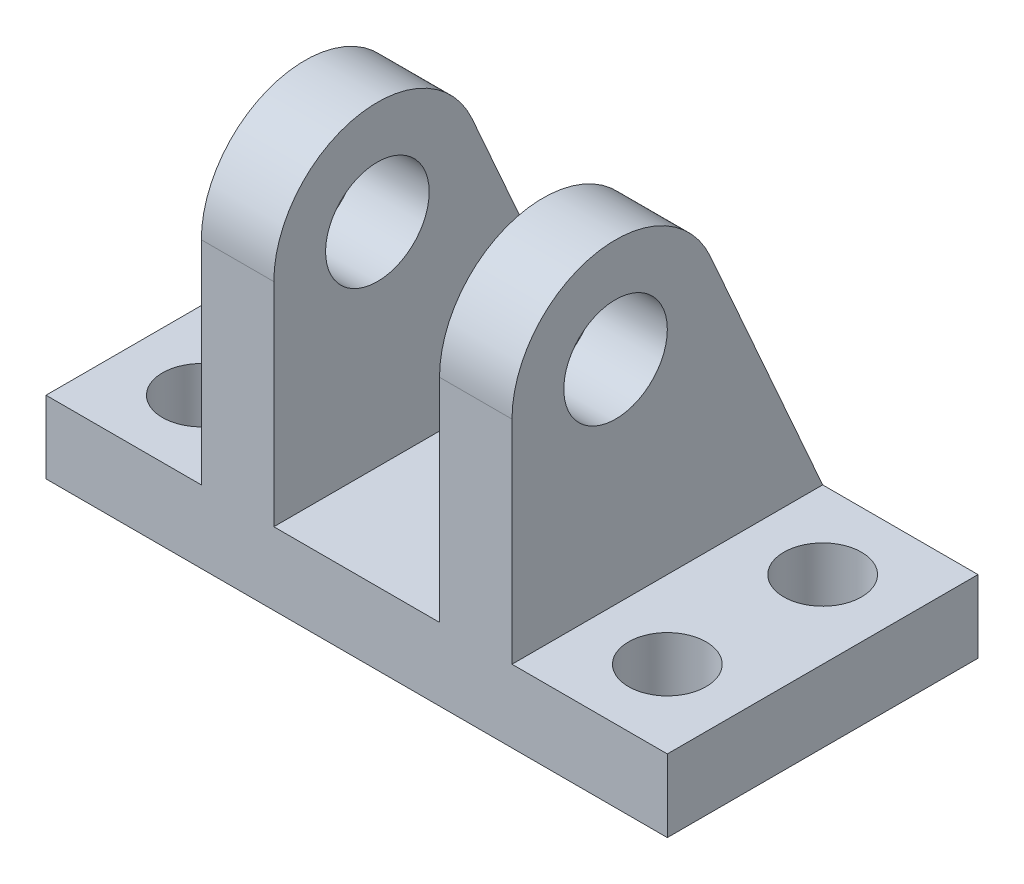
ISO-10303-21;
HEADER;
FILE_DESCRIPTION(('STEP AP214'),'2;1');
FILE_NAME('part.step','',(''),(''),'','','');
FILE_SCHEMA(('AUTOMOTIVE_DESIGN { 1 0 10303 214 1 1 1 1 }'));
ENDSEC;
DATA;
#1=APPLICATION_CONTEXT('core data for automotive mechanical design processes');
#2=APPLICATION_PROTOCOL_DEFINITION('international standard','automotive_design',2000,#1);
#3=PRODUCT_CONTEXT('',#1,'mechanical');
#4=PRODUCT('Part','Part','',(#3));
#5=PRODUCT_RELATED_PRODUCT_CATEGORY('part','',(#4));
#6=PRODUCT_DEFINITION_FORMATION('','',#4);
#7=PRODUCT_DEFINITION_CONTEXT('part definition',#1,'design');
#8=PRODUCT_DEFINITION('design','',#6,#7);
#9=PRODUCT_DEFINITION_SHAPE('','',#8);
#10=(LENGTH_UNIT() NAMED_UNIT(*) SI_UNIT(.MILLI.,.METRE.));
#11=(NAMED_UNIT(*) PLANE_ANGLE_UNIT() SI_UNIT($,.RADIAN.));
#12=(NAMED_UNIT(*) SI_UNIT($,.STERADIAN.) SOLID_ANGLE_UNIT());
#13=UNCERTAINTY_MEASURE_WITH_UNIT(LENGTH_MEASURE(1.E-05),#10,'distance_accuracy_value','');
#14=(GEOMETRIC_REPRESENTATION_CONTEXT(3) GLOBAL_UNCERTAINTY_ASSIGNED_CONTEXT((#13)) GLOBAL_UNIT_ASSIGNED_CONTEXT((#10,
#11,#12)) REPRESENTATION_CONTEXT('',''));
#15=CARTESIAN_POINT('',(0.,0.,0.));
#16=DIRECTION('',(0.,0.,1.));
#17=DIRECTION('',(1.,0.,0.));
#18=AXIS2_PLACEMENT_3D('',#15,#16,#17);
#19=CARTESIAN_POINT('',(6.,15.,6.));
#20=DIRECTION('',(-1.,0.,0.));
#21=DIRECTION('',(0.,0.,1.));
#22=AXIS2_PLACEMENT_3D('',#19,#20,#21);
#23=PLANE('',#22);
#24=CARTESIAN_POINT('',(6.,11.,2.));
#25=DIRECTION('',(1.,0.,0.));
#26=DIRECTION('',(0.,0.,-1.));
#27=AXIS2_PLACEMENT_3D('',#24,#25,#26);
#28=CIRCLE('',#27,2.);
#29=CARTESIAN_POINT('',(6.,11.,0.));
#30=VERTEX_POINT('',#29);
#31=EDGE_CURVE('E189',#30,#30,#28,.T.);
#32=ORIENTED_EDGE('',*,*,#31,.F.);
#33=EDGE_LOOP('',(#32));
#34=FACE_BOUND('',#33,.T.);
#35=DIRECTION('',(0.,-1.,0.));
#36=VECTOR('',#35,1.);
#37=CARTESIAN_POINT('',(6.,15.,6.));
#38=LINE('',#37,#36);
#39=CARTESIAN_POINT('',(6.,11.,6.));
#40=VERTEX_POINT('',#39);
#41=CARTESIAN_POINT('',(6.,2.8,6.));
#42=VERTEX_POINT('',#41);
#43=EDGE_CURVE('E247',#40,#42,#38,.T.);
#44=ORIENTED_EDGE('',*,*,#43,.T.);
#45=DIRECTION('',(0.,0.,-1.));
#46=VECTOR('',#45,1.);
#47=CARTESIAN_POINT('',(6.,2.8,-6.));
#48=LINE('',#47,#46);
#49=CARTESIAN_POINT('',(6.,2.8,-6.));
#50=VERTEX_POINT('',#49);
#51=EDGE_CURVE('E132',#42,#50,#48,.T.);
#52=ORIENTED_EDGE('',*,*,#51,.T.);
#53=DIRECTION('',(0.,0.914560454633472,0.404449224032656));
#54=VECTOR('',#53,1.);
#55=CARTESIAN_POINT('',(6.,2.67738128674249,-6.05422609645719));
#56=LINE('',#55,#54);
#57=CARTESIAN_POINT('',(6.,12.6177968961306,-1.65824181853389));
#58=VERTEX_POINT('',#57);
#59=EDGE_CURVE('E207',#50,#58,#56,.T.);
#60=ORIENTED_EDGE('',*,*,#59,.T.);
#61=CARTESIAN_POINT('',(6.,11.,2.));
#62=DIRECTION('',(-1.,0.,0.));
#63=DIRECTION('',(0.,0.,1.));
#64=AXIS2_PLACEMENT_3D('',#61,#62,#63);
#65=CIRCLE('',#64,4.);
#66=EDGE_CURVE('E205',#40,#58,#65,.T.);
#67=ORIENTED_EDGE('',*,*,#66,.F.);
#68=EDGE_LOOP('',(#44,#52,#60,#67));
#69=FACE_BOUND('',#68,.T.);
#70=ADVANCED_FACE('F38',(#34,#69),#23,.F.);
#71=CARTESIAN_POINT('',(-6.,15.,6.));
#72=DIRECTION('',(1.,0.,0.));
#73=DIRECTION('',(0.,0.,-1.));
#74=AXIS2_PLACEMENT_3D('',#71,#72,#73);
#75=PLANE('',#74);
#76=CARTESIAN_POINT('',(-6.,11.,2.));
#77=DIRECTION('',(1.,0.,0.));
#78=DIRECTION('',(0.,0.,-1.));
#79=AXIS2_PLACEMENT_3D('',#76,#77,#78);
#80=CIRCLE('',#79,2.);
#81=CARTESIAN_POINT('',(-6.,11.,0.));
#82=VERTEX_POINT('',#81);
#83=EDGE_CURVE('E192',#82,#82,#80,.T.);
#84=ORIENTED_EDGE('',*,*,#83,.T.);
#85=EDGE_LOOP('',(#84));
#86=FACE_BOUND('',#85,.T.);
#87=DIRECTION('',(0.,0.914560454633472,0.404449224032656));
#88=VECTOR('',#87,1.);
#89=CARTESIAN_POINT('',(-6.,2.67738128674249,-6.05422609645719));
#90=LINE('',#89,#88);
#91=CARTESIAN_POINT('',(-6.,2.8,-6.));
#92=VERTEX_POINT('',#91);
#93=CARTESIAN_POINT('',(-6.,12.6177968961306,-1.65824181853389));
#94=VERTEX_POINT('',#93);
#95=EDGE_CURVE('E208',#92,#94,#90,.T.);
#96=ORIENTED_EDGE('',*,*,#95,.F.);
#97=DIRECTION('',(0.,0.,1.));
#98=VECTOR('',#97,1.);
#99=CARTESIAN_POINT('',(-6.,2.8,-6.));
#100=LINE('',#99,#98);
#101=CARTESIAN_POINT('',(-6.,2.8,6.));
#102=VERTEX_POINT('',#101);
#103=EDGE_CURVE('E172',#92,#102,#100,.T.);
#104=ORIENTED_EDGE('',*,*,#103,.T.);
#105=DIRECTION('',(0.,-1.,0.));
#106=VECTOR('',#105,1.);
#107=CARTESIAN_POINT('',(-6.,15.,6.));
#108=LINE('',#107,#106);
#109=CARTESIAN_POINT('',(-6.,11.,6.));
#110=VERTEX_POINT('',#109);
#111=EDGE_CURVE('E46',#110,#102,#108,.T.);
#112=ORIENTED_EDGE('',*,*,#111,.F.);
#113=CARTESIAN_POINT('',(-6.,11.,2.));
#114=DIRECTION('',(-1.,0.,0.));
#115=DIRECTION('',(0.,0.,1.));
#116=AXIS2_PLACEMENT_3D('',#113,#114,#115);
#117=CIRCLE('',#116,4.);
#118=EDGE_CURVE('E204',#110,#94,#117,.T.);
#119=ORIENTED_EDGE('',*,*,#118,.T.);
#120=EDGE_LOOP('',(#96,#104,#112,#119));
#121=FACE_BOUND('',#120,.T.);
#122=ADVANCED_FACE('F256',(#86,#121),#75,.F.);
#123=CARTESIAN_POINT('',(-3.2,15.,-6.));
#124=DIRECTION('',(-1.,0.,0.));
#125=DIRECTION('',(0.,-1.,0.));
#126=AXIS2_PLACEMENT_3D('',#123,#124,#125);
#127=PLANE('',#126);
#128=CARTESIAN_POINT('',(-3.2,11.,2.));
#129=DIRECTION('',(-1.,0.,0.));
#130=DIRECTION('',(0.,-1.,0.));
#131=AXIS2_PLACEMENT_3D('',#128,#129,#130);
#132=CIRCLE('',#131,2.);
#133=CARTESIAN_POINT('',(-3.2,9.,2.));
#134=VERTEX_POINT('',#133);
#135=EDGE_CURVE('E197',#134,#134,#132,.T.);
#136=ORIENTED_EDGE('',*,*,#135,.T.);
#137=EDGE_LOOP('',(#136));
#138=FACE_BOUND('',#137,.T.);
#139=CARTESIAN_POINT('',(-3.2,11.,2.));
#140=DIRECTION('',(-1.,0.,0.));
#141=DIRECTION('',(0.,-1.,0.));
#142=AXIS2_PLACEMENT_3D('',#139,#140,#141);
#143=CIRCLE('',#142,4.);
#144=CARTESIAN_POINT('',(-3.2,11.,6.));
#145=VERTEX_POINT('',#144);
#146=CARTESIAN_POINT('',(-3.2,12.6177968961306,-1.65824181853389));
#147=VERTEX_POINT('',#146);
#148=EDGE_CURVE('E226',#145,#147,#143,.T.);
#149=ORIENTED_EDGE('',*,*,#148,.F.);
#150=DIRECTION('',(0.,-1.,0.));
#151=VECTOR('',#150,1.);
#152=CARTESIAN_POINT('',(-3.2,15.,6.));
#153=LINE('',#152,#151);
#154=CARTESIAN_POINT('',(-3.2,2.8,6.));
#155=VERTEX_POINT('',#154);
#156=EDGE_CURVE('E228',#145,#155,#153,.T.);
#157=ORIENTED_EDGE('',*,*,#156,.T.);
#158=DIRECTION('',(0.,0.,1.));
#159=VECTOR('',#158,1.);
#160=CARTESIAN_POINT('',(-3.2,2.8,-6.));
#161=LINE('',#160,#159);
#162=CARTESIAN_POINT('',(-3.2,2.8,-6.));
#163=VERTEX_POINT('',#162);
#164=EDGE_CURVE('E232',#163,#155,#161,.T.);
#165=ORIENTED_EDGE('',*,*,#164,.F.);
#166=DIRECTION('',(0.,0.914560454633472,0.404449224032656));
#167=VECTOR('',#166,1.);
#168=CARTESIAN_POINT('',(-3.2,13.0043340671885,-1.48730215226898));
#169=LINE('',#168,#167);
#170=EDGE_CURVE('E223',#163,#147,#169,.T.);
#171=ORIENTED_EDGE('',*,*,#170,.T.);
#172=EDGE_LOOP('',(#149,#157,#165,#171));
#173=FACE_BOUND('',#172,.T.);
#174=ADVANCED_FACE('F266',(#138,#173),#127,.F.);
#175=CARTESIAN_POINT('',(3.2,15.,-6.));
#176=DIRECTION('',(1.,0.,0.));
#177=DIRECTION('',(0.,1.,0.));
#178=AXIS2_PLACEMENT_3D('',#175,#176,#177);
#179=PLANE('',#178);
#180=CARTESIAN_POINT('',(3.2,11.,2.));
#181=DIRECTION('',(1.,0.,0.));
#182=DIRECTION('',(0.,1.,0.));
#183=AXIS2_PLACEMENT_3D('',#180,#181,#182);
#184=CIRCLE('',#183,2.);
#185=CARTESIAN_POINT('',(3.2,13.,2.));
#186=VERTEX_POINT('',#185);
#187=EDGE_CURVE('E41',#186,#186,#184,.T.);
#188=ORIENTED_EDGE('',*,*,#187,.T.);
#189=EDGE_LOOP('',(#188));
#190=FACE_BOUND('',#189,.T.);
#191=DIRECTION('',(0.,1.,0.));
#192=VECTOR('',#191,1.);
#193=CARTESIAN_POINT('',(3.2,15.,6.));
#194=LINE('',#193,#192);
#195=CARTESIAN_POINT('',(3.2,2.8,6.));
#196=VERTEX_POINT('',#195);
#197=CARTESIAN_POINT('',(3.2,11.,6.));
#198=VERTEX_POINT('',#197);
#199=EDGE_CURVE('E233',#196,#198,#194,.T.);
#200=ORIENTED_EDGE('',*,*,#199,.T.);
#201=CARTESIAN_POINT('',(3.2,11.,2.));
#202=DIRECTION('',(1.,0.,0.));
#203=DIRECTION('',(0.,1.,0.));
#204=AXIS2_PLACEMENT_3D('',#201,#202,#203);
#205=CIRCLE('',#204,4.);
#206=CARTESIAN_POINT('',(3.2,12.6177968961306,-1.65824181853389));
#207=VERTEX_POINT('',#206);
#208=EDGE_CURVE('E11',#207,#198,#205,.T.);
#209=ORIENTED_EDGE('',*,*,#208,.F.);
#210=DIRECTION('',(0.,-0.914560454633472,-0.404449224032656));
#211=VECTOR('',#210,1.);
#212=CARTESIAN_POINT('',(3.2,13.0043340671885,-1.48730215226898));
#213=LINE('',#212,#211);
#214=CARTESIAN_POINT('',(3.2,2.8,-6.));
#215=VERTEX_POINT('',#214);
#216=EDGE_CURVE('E218',#207,#215,#213,.T.);
#217=ORIENTED_EDGE('',*,*,#216,.T.);
#218=DIRECTION('',(0.,0.,1.));
#219=VECTOR('',#218,1.);
#220=CARTESIAN_POINT('',(3.2,2.8,-6.));
#221=LINE('',#220,#219);
#222=EDGE_CURVE('E240',#215,#196,#221,.T.);
#223=ORIENTED_EDGE('',*,*,#222,.T.);
#224=EDGE_LOOP('',(#200,#209,#217,#223));
#225=FACE_BOUND('',#224,.T.);
#226=ADVANCED_FACE('F279',(#190,#225),#179,.F.);
#227=CARTESIAN_POINT('',(-6.,15.,-6.));
#228=DIRECTION('',(0.,0.,1.));
#229=DIRECTION('',(1.,0.,0.));
#230=AXIS2_PLACEMENT_3D('',#227,#228,#229);
#231=PLANE('',#230);
#232=DIRECTION('',(-1.,0.,0.));
#233=VECTOR('',#232,1.);
#234=CARTESIAN_POINT('',(-6.,0.,-6.));
#235=LINE('',#234,#233);
#236=CARTESIAN_POINT('',(12.,0.,-6.));
#237=VERTEX_POINT('',#236);
#238=CARTESIAN_POINT('',(-12.,0.,-6.));
#239=VERTEX_POINT('',#238);
#240=EDGE_CURVE('E242',#237,#239,#235,.T.);
#241=ORIENTED_EDGE('',*,*,#240,.T.);
#242=DIRECTION('',(0.,-1.,0.));
#243=VECTOR('',#242,1.);
#244=CARTESIAN_POINT('',(-12.,16.2164078649987,-6.));
#245=LINE('',#244,#243);
#246=CARTESIAN_POINT('',(-12.,2.8,-6.));
#247=VERTEX_POINT('',#246);
#248=EDGE_CURVE('E166',#247,#239,#245,.T.);
#249=ORIENTED_EDGE('',*,*,#248,.F.);
#250=DIRECTION('',(1.,0.,0.));
#251=VECTOR('',#250,1.);
#252=CARTESIAN_POINT('',(-6.,2.8,-6.));
#253=LINE('',#252,#251);
#254=EDGE_CURVE('E180',#247,#92,#253,.T.);
#255=ORIENTED_EDGE('',*,*,#254,.T.);
#256=DIRECTION('',(-1.,0.,0.));
#257=VECTOR('',#256,1.);
#258=CARTESIAN_POINT('',(6.,2.8,-6.));
#259=LINE('',#258,#257);
#260=EDGE_CURVE('E211',#163,#92,#259,.T.);
#261=ORIENTED_EDGE('',*,*,#260,.F.);
#262=DIRECTION('',(1.,0.,0.));
#263=VECTOR('',#262,1.);
#264=CARTESIAN_POINT('',(-3.2,2.8,-6.));
#265=LINE('',#264,#263);
#266=EDGE_CURVE('E229',#163,#215,#265,.T.);
#267=ORIENTED_EDGE('',*,*,#266,.T.);
#268=EDGE_CURVE('E219',#50,#215,#259,.T.);
#269=ORIENTED_EDGE('',*,*,#268,.F.);
#270=DIRECTION('',(1.,0.,0.));
#271=VECTOR('',#270,1.);
#272=CARTESIAN_POINT('',(6.,2.8,-6.));
#273=LINE('',#272,#271);
#274=CARTESIAN_POINT('',(12.,2.8,-6.));
#275=VERTEX_POINT('',#274);
#276=EDGE_CURVE('E154',#50,#275,#273,.T.);
#277=ORIENTED_EDGE('',*,*,#276,.T.);
#278=DIRECTION('',(0.,-1.,0.));
#279=VECTOR('',#278,1.);
#280=CARTESIAN_POINT('',(12.,16.2164078649987,-6.));
#281=LINE('',#280,#279);
#282=EDGE_CURVE('E149',#275,#237,#281,.T.);
#283=ORIENTED_EDGE('',*,*,#282,.T.);
#284=EDGE_LOOP('',(#241,#249,#255,#261,#267,#269,#277,#283));
#285=FACE_BOUND('',#284,.T.);
#286=ADVANCED_FACE('F262',(#285),#231,.F.);
#287=CARTESIAN_POINT('',(-6.,15.,6.));
#288=DIRECTION('',(0.,0.,-1.));
#289=DIRECTION('',(-1.,0.,0.));
#290=AXIS2_PLACEMENT_3D('',#287,#288,#289);
#291=PLANE('',#290);
#292=ORIENTED_EDGE('',*,*,#43,.F.);
#293=DIRECTION('',(-1.,0.,0.));
#294=VECTOR('',#293,1.);
#295=CARTESIAN_POINT('',(6.,11.,6.));
#296=LINE('',#295,#294);
#297=EDGE_CURVE('E201',#40,#198,#296,.T.);
#298=ORIENTED_EDGE('',*,*,#297,.T.);
#299=ORIENTED_EDGE('',*,*,#199,.F.);
#300=DIRECTION('',(1.,0.,0.));
#301=VECTOR('',#300,1.);
#302=CARTESIAN_POINT('',(-3.2,2.8,6.));
#303=LINE('',#302,#301);
#304=EDGE_CURVE('E235',#155,#196,#303,.T.);
#305=ORIENTED_EDGE('',*,*,#304,.F.);
#306=ORIENTED_EDGE('',*,*,#156,.F.);
#307=EDGE_CURVE('E200',#145,#110,#296,.T.);
#308=ORIENTED_EDGE('',*,*,#307,.T.);
#309=ORIENTED_EDGE('',*,*,#111,.T.);
#310=DIRECTION('',(-1.,0.,0.));
#311=VECTOR('',#310,1.);
#312=CARTESIAN_POINT('',(-6.,2.8,6.));
#313=LINE('',#312,#311);
#314=CARTESIAN_POINT('',(-12.,2.8,6.));
#315=VERTEX_POINT('',#314);
#316=EDGE_CURVE('E53',#102,#315,#313,.T.);
#317=ORIENTED_EDGE('',*,*,#316,.T.);
#318=DIRECTION('',(0.,-1.,0.));
#319=VECTOR('',#318,1.);
#320=CARTESIAN_POINT('',(-12.,16.2164078649987,6.));
#321=LINE('',#320,#319);
#322=CARTESIAN_POINT('',(-12.,0.,6.));
#323=VERTEX_POINT('',#322);
#324=EDGE_CURVE('E176',#315,#323,#321,.T.);
#325=ORIENTED_EDGE('',*,*,#324,.T.);
#326=DIRECTION('',(1.,0.,0.));
#327=VECTOR('',#326,1.);
#328=CARTESIAN_POINT('',(-6.,0.,6.));
#329=LINE('',#328,#327);
#330=CARTESIAN_POINT('',(12.,0.,6.));
#331=VERTEX_POINT('',#330);
#332=EDGE_CURVE('E141',#323,#331,#329,.T.);
#333=ORIENTED_EDGE('',*,*,#332,.T.);
#334=DIRECTION('',(0.,-1.,0.));
#335=VECTOR('',#334,1.);
#336=CARTESIAN_POINT('',(12.,16.2164078649987,6.));
#337=LINE('',#336,#335);
#338=CARTESIAN_POINT('',(12.,2.8,6.));
#339=VERTEX_POINT('',#338);
#340=EDGE_CURVE('E138',#339,#331,#337,.T.);
#341=ORIENTED_EDGE('',*,*,#340,.F.);
#342=DIRECTION('',(-1.,0.,0.));
#343=VECTOR('',#342,1.);
#344=CARTESIAN_POINT('',(6.,2.8,6.));
#345=LINE('',#344,#343);
#346=EDGE_CURVE('E125',#339,#42,#345,.T.);
#347=ORIENTED_EDGE('',*,*,#346,.T.);
#348=EDGE_LOOP('',(#292,#298,#299,#305,#306,#308,#309,#317,#325,#333,#341,#347));
#349=FACE_BOUND('',#348,.T.);
#350=ADVANCED_FACE('F139',(#349),#291,.F.);
#351=CARTESIAN_POINT('',(0.,0.,0.));
#352=DIRECTION('',(0.,-1.,0.));
#353=DIRECTION('',(0.,0.,-1.));
#354=AXIS2_PLACEMENT_3D('',#351,#352,#353);
#355=PLANE('',#354);
#356=ORIENTED_EDGE('',*,*,#240,.F.);
#357=DIRECTION('',(0.,0.,-1.));
#358=VECTOR('',#357,1.);
#359=CARTESIAN_POINT('',(12.,0.,-6.));
#360=LINE('',#359,#358);
#361=EDGE_CURVE('E145',#331,#237,#360,.T.);
#362=ORIENTED_EDGE('',*,*,#361,.F.);
#363=ORIENTED_EDGE('',*,*,#332,.F.);
#364=DIRECTION('',(0.,0.,1.));
#365=VECTOR('',#364,1.);
#366=CARTESIAN_POINT('',(-12.,0.,-6.));
#367=LINE('',#366,#365);
#368=EDGE_CURVE('E163',#239,#323,#367,.T.);
#369=ORIENTED_EDGE('',*,*,#368,.F.);
#370=EDGE_LOOP('',(#356,#362,#363,#369));
#371=FACE_BOUND('',#370,.T.);
#372=CARTESIAN_POINT('',(-9.,0.,-3.));
#373=DIRECTION('',(0.,1.,0.));
#374=DIRECTION('',(0.,0.,1.));
#375=AXIS2_PLACEMENT_3D('',#372,#373,#374);
#376=CIRCLE('',#375,1.5);
#377=CARTESIAN_POINT('',(-9.,0.,-1.5));
#378=VERTEX_POINT('',#377);
#379=EDGE_CURVE('E159',#378,#378,#376,.T.);
#380=ORIENTED_EDGE('',*,*,#379,.T.);
#381=EDGE_LOOP('',(#380));
#382=FACE_BOUND('',#381,.T.);
#383=CARTESIAN_POINT('',(-9.,0.,3.));
#384=DIRECTION('',(0.,1.,0.));
#385=DIRECTION('',(0.,0.,1.));
#386=AXIS2_PLACEMENT_3D('',#383,#384,#385);
#387=CIRCLE('',#386,1.5);
#388=CARTESIAN_POINT('',(-9.,0.,4.5));
#389=VERTEX_POINT('',#388);
#390=EDGE_CURVE('E169',#389,#389,#387,.T.);
#391=ORIENTED_EDGE('',*,*,#390,.T.);
#392=EDGE_LOOP('',(#391));
#393=FACE_BOUND('',#392,.T.);
#394=CARTESIAN_POINT('',(9.,0.,-3.));
#395=DIRECTION('',(0.,1.,0.));
#396=DIRECTION('',(0.,0.,1.));
#397=AXIS2_PLACEMENT_3D('',#394,#395,#396);
#398=CIRCLE('',#397,1.5);
#399=CARTESIAN_POINT('',(9.,0.,-1.5));
#400=VERTEX_POINT('',#399);
#401=EDGE_CURVE('E287',#400,#400,#398,.T.);
#402=ORIENTED_EDGE('',*,*,#401,.T.);
#403=EDGE_LOOP('',(#402));
#404=FACE_BOUND('',#403,.T.);
#405=CARTESIAN_POINT('',(9.,0.,3.));
#406=DIRECTION('',(0.,1.,0.));
#407=DIRECTION('',(0.,0.,1.));
#408=AXIS2_PLACEMENT_3D('',#405,#406,#407);
#409=CIRCLE('',#408,1.5);
#410=CARTESIAN_POINT('',(9.,0.,4.5));
#411=VERTEX_POINT('',#410);
#412=EDGE_CURVE('E285',#411,#411,#409,.T.);
#413=ORIENTED_EDGE('',*,*,#412,.T.);
#414=EDGE_LOOP('',(#413));
#415=FACE_BOUND('',#414,.T.);
#416=ADVANCED_FACE('F294',(#371,#382,#393,#404,#415),#355,.T.);
#417=CARTESIAN_POINT('',(-3.2,2.8,-6.));
#418=DIRECTION('',(0.,-1.,0.));
#419=DIRECTION('',(0.,0.,-1.));
#420=AXIS2_PLACEMENT_3D('',#417,#418,#419);
#421=PLANE('',#420);
#422=ORIENTED_EDGE('',*,*,#304,.T.);
#423=ORIENTED_EDGE('',*,*,#222,.F.);
#424=ORIENTED_EDGE('',*,*,#266,.F.);
#425=ORIENTED_EDGE('',*,*,#164,.T.);
#426=EDGE_LOOP('',(#422,#423,#424,#425));
#427=FACE_BOUND('',#426,.T.);
#428=ADVANCED_FACE('F271',(#427),#421,.F.);
#429=CARTESIAN_POINT('',(6.,2.67738128674249,-6.05422609645719));
#430=DIRECTION('',(0.,-0.404449224032655,0.914560454633472));
#431=DIRECTION('',(0.,-0.914560454633472,-0.404449224032656));
#432=AXIS2_PLACEMENT_3D('',#429,#430,#431);
#433=PLANE('',#432);
#434=DIRECTION('',(-1.,0.,0.));
#435=VECTOR('',#434,1.);
#436=CARTESIAN_POINT('',(6.,12.6177968961306,-1.65824181853389));
#437=LINE('',#436,#435);
#438=EDGE_CURVE('E215',#58,#207,#437,.T.);
#439=ORIENTED_EDGE('',*,*,#438,.F.);
#440=ORIENTED_EDGE('',*,*,#59,.F.);
#441=ORIENTED_EDGE('',*,*,#268,.T.);
#442=ORIENTED_EDGE('',*,*,#216,.F.);
#443=EDGE_LOOP('',(#439,#440,#441,#442));
#444=FACE_BOUND('',#443,.T.);
#445=ADVANCED_FACE('F276',(#444),#433,.F.);
#446=CARTESIAN_POINT('',(6.,11.,2.));
#447=DIRECTION('',(-1.,0.,0.));
#448=DIRECTION('',(0.,0.,1.));
#449=AXIS2_PLACEMENT_3D('',#446,#447,#448);
#450=CYLINDRICAL_SURFACE('',#449,4.);
#451=ORIENTED_EDGE('',*,*,#208,.T.);
#452=ORIENTED_EDGE('',*,*,#297,.F.);
#453=ORIENTED_EDGE('',*,*,#66,.T.);
#454=ORIENTED_EDGE('',*,*,#438,.T.);
#455=EDGE_LOOP('',(#451,#452,#453,#454));
#456=FACE_BOUND('',#455,.T.);
#457=ADVANCED_FACE('F283',(#456),#450,.T.);
#458=ORIENTED_EDGE('',*,*,#148,.T.);
#459=EDGE_CURVE('E61',#147,#94,#437,.T.);
#460=ORIENTED_EDGE('',*,*,#459,.T.);
#461=ORIENTED_EDGE('',*,*,#118,.F.);
#462=ORIENTED_EDGE('',*,*,#307,.F.);
#463=EDGE_LOOP('',(#458,#460,#461,#462));
#464=FACE_BOUND('',#463,.T.);
#465=ADVANCED_FACE('F339',(#464),#450,.T.);
#466=ORIENTED_EDGE('',*,*,#260,.T.);
#467=ORIENTED_EDGE('',*,*,#95,.T.);
#468=ORIENTED_EDGE('',*,*,#459,.F.);
#469=ORIENTED_EDGE('',*,*,#170,.F.);
#470=EDGE_LOOP('',(#466,#467,#468,#469));
#471=FACE_BOUND('',#470,.T.);
#472=ADVANCED_FACE('F264',(#471),#433,.F.);
#473=CARTESIAN_POINT('',(-6.,11.,2.));
#474=DIRECTION('',(1.,0.,0.));
#475=DIRECTION('',(0.,0.,-1.));
#476=AXIS2_PLACEMENT_3D('',#473,#474,#475);
#477=CYLINDRICAL_SURFACE('',#476,2.);
#478=ORIENTED_EDGE('',*,*,#31,.T.);
#479=EDGE_LOOP('',(#478));
#480=FACE_BOUND('',#479,.T.);
#481=ORIENTED_EDGE('',*,*,#187,.F.);
#482=EDGE_LOOP('',(#481));
#483=FACE_BOUND('',#482,.T.);
#484=ADVANCED_FACE('F311',(#480,#483),#477,.F.);
#485=ORIENTED_EDGE('',*,*,#83,.F.);
#486=EDGE_LOOP('',(#485));
#487=FACE_BOUND('',#486,.T.);
#488=ORIENTED_EDGE('',*,*,#135,.F.);
#489=EDGE_LOOP('',(#488));
#490=FACE_BOUND('',#489,.T.);
#491=ADVANCED_FACE('F302',(#487,#490),#477,.F.);
#492=CARTESIAN_POINT('',(-12.,16.2164078649987,-6.));
#493=DIRECTION('',(1.,0.,0.));
#494=DIRECTION('',(0.,0.,-1.));
#495=AXIS2_PLACEMENT_3D('',#492,#493,#494);
#496=PLANE('',#495);
#497=ORIENTED_EDGE('',*,*,#324,.F.);
#498=DIRECTION('',(0.,0.,-1.));
#499=VECTOR('',#498,1.);
#500=CARTESIAN_POINT('',(-12.,2.8,-6.));
#501=LINE('',#500,#499);
#502=EDGE_CURVE('E175',#315,#247,#501,.T.);
#503=ORIENTED_EDGE('',*,*,#502,.T.);
#504=ORIENTED_EDGE('',*,*,#248,.T.);
#505=ORIENTED_EDGE('',*,*,#368,.T.);
#506=EDGE_LOOP('',(#497,#503,#504,#505));
#507=FACE_BOUND('',#506,.T.);
#508=ADVANCED_FACE('F299',(#507),#496,.F.);
#509=CARTESIAN_POINT('',(-9.,16.2164078649987,-3.));
#510=DIRECTION('',(0.,-1.,0.));
#511=DIRECTION('',(0.,0.,-1.));
#512=AXIS2_PLACEMENT_3D('',#509,#510,#511);
#513=CYLINDRICAL_SURFACE('',#512,1.5);
#514=CARTESIAN_POINT('',(-9.,2.8,-3.));
#515=DIRECTION('',(0.,-1.,0.));
#516=DIRECTION('',(0.,0.,-1.));
#517=AXIS2_PLACEMENT_3D('',#514,#515,#516);
#518=CIRCLE('',#517,1.5);
#519=CARTESIAN_POINT('',(-9.,2.8,-4.5));
#520=VERTEX_POINT('',#519);
#521=EDGE_CURVE('E186',#520,#520,#518,.T.);
#522=ORIENTED_EDGE('',*,*,#521,.F.);
#523=EDGE_LOOP('',(#522));
#524=FACE_BOUND('',#523,.T.);
#525=ORIENTED_EDGE('',*,*,#379,.F.);
#526=EDGE_LOOP('',(#525));
#527=FACE_BOUND('',#526,.T.);
#528=ADVANCED_FACE('F301',(#524,#527),#513,.F.);
#529=CARTESIAN_POINT('',(-9.,16.2164078649987,3.));
#530=DIRECTION('',(0.,-1.,0.));
#531=DIRECTION('',(0.,0.,-1.));
#532=AXIS2_PLACEMENT_3D('',#529,#530,#531);
#533=CYLINDRICAL_SURFACE('',#532,1.5);
#534=CARTESIAN_POINT('',(-9.,2.8,3.));
#535=DIRECTION('',(0.,-1.,0.));
#536=DIRECTION('',(0.,0.,-1.));
#537=AXIS2_PLACEMENT_3D('',#534,#535,#536);
#538=CIRCLE('',#537,1.5);
#539=CARTESIAN_POINT('',(-9.,2.8,1.5));
#540=VERTEX_POINT('',#539);
#541=EDGE_CURVE('E178',#540,#540,#538,.T.);
#542=ORIENTED_EDGE('',*,*,#541,.F.);
#543=EDGE_LOOP('',(#542));
#544=FACE_BOUND('',#543,.T.);
#545=ORIENTED_EDGE('',*,*,#390,.F.);
#546=EDGE_LOOP('',(#545));
#547=FACE_BOUND('',#546,.T.);
#548=ADVANCED_FACE('F308',(#544,#547),#533,.F.);
#549=CARTESIAN_POINT('',(-3.2,2.8,-6.));
#550=DIRECTION('',(0.,-1.,0.));
#551=DIRECTION('',(0.,0.,-1.));
#552=AXIS2_PLACEMENT_3D('',#549,#550,#551);
#553=PLANE('',#552);
#554=ORIENTED_EDGE('',*,*,#541,.T.);
#555=EDGE_LOOP('',(#554));
#556=FACE_BOUND('',#555,.T.);
#557=ORIENTED_EDGE('',*,*,#521,.T.);
#558=EDGE_LOOP('',(#557));
#559=FACE_BOUND('',#558,.T.);
#560=ORIENTED_EDGE('',*,*,#254,.F.);
#561=ORIENTED_EDGE('',*,*,#502,.F.);
#562=ORIENTED_EDGE('',*,*,#316,.F.);
#563=ORIENTED_EDGE('',*,*,#103,.F.);
#564=EDGE_LOOP('',(#560,#561,#562,#563));
#565=FACE_BOUND('',#564,.T.);
#566=ADVANCED_FACE('F257',(#556,#559,#565),#553,.F.);
#567=CARTESIAN_POINT('',(12.,16.2164078649987,-6.));
#568=DIRECTION('',(-1.,0.,0.));
#569=DIRECTION('',(0.,0.,1.));
#570=AXIS2_PLACEMENT_3D('',#567,#568,#569);
#571=PLANE('',#570);
#572=ORIENTED_EDGE('',*,*,#282,.F.);
#573=DIRECTION('',(0.,0.,1.));
#574=VECTOR('',#573,1.);
#575=CARTESIAN_POINT('',(12.,2.8,-6.));
#576=LINE('',#575,#574);
#577=EDGE_CURVE('E129',#275,#339,#576,.T.);
#578=ORIENTED_EDGE('',*,*,#577,.T.);
#579=ORIENTED_EDGE('',*,*,#340,.T.);
#580=ORIENTED_EDGE('',*,*,#361,.T.);
#581=EDGE_LOOP('',(#572,#578,#579,#580));
#582=FACE_BOUND('',#581,.T.);
#583=ADVANCED_FACE('F147',(#582),#571,.F.);
#584=CARTESIAN_POINT('',(9.,16.2164078649987,-3.));
#585=DIRECTION('',(0.,-1.,0.));
#586=DIRECTION('',(0.,0.,-1.));
#587=AXIS2_PLACEMENT_3D('',#584,#585,#586);
#588=CYLINDRICAL_SURFACE('',#587,1.5);
#589=CARTESIAN_POINT('',(9.,2.8,-3.));
#590=DIRECTION('',(0.,-1.,0.));
#591=DIRECTION('',(0.,0.,-1.));
#592=AXIS2_PLACEMENT_3D('',#589,#590,#591);
#593=CIRCLE('',#592,1.5);
#594=CARTESIAN_POINT('',(9.,2.8,-4.5));
#595=VERTEX_POINT('',#594);
#596=EDGE_CURVE('E156',#595,#595,#593,.T.);
#597=ORIENTED_EDGE('',*,*,#596,.F.);
#598=EDGE_LOOP('',(#597));
#599=FACE_BOUND('',#598,.T.);
#600=ORIENTED_EDGE('',*,*,#401,.F.);
#601=EDGE_LOOP('',(#600));
#602=FACE_BOUND('',#601,.T.);
#603=ADVANCED_FACE('F457',(#599,#602),#588,.F.);
#604=CARTESIAN_POINT('',(9.,16.2164078649987,3.));
#605=DIRECTION('',(0.,-1.,0.));
#606=DIRECTION('',(0.,0.,-1.));
#607=AXIS2_PLACEMENT_3D('',#604,#605,#606);
#608=CYLINDRICAL_SURFACE('',#607,1.5);
#609=CARTESIAN_POINT('',(9.,2.8,3.));
#610=DIRECTION('',(0.,-1.,0.));
#611=DIRECTION('',(0.,0.,-1.));
#612=AXIS2_PLACEMENT_3D('',#609,#610,#611);
#613=CIRCLE('',#612,1.5);
#614=CARTESIAN_POINT('',(9.,2.8,1.5));
#615=VERTEX_POINT('',#614);
#616=EDGE_CURVE('E160',#615,#615,#613,.T.);
#617=ORIENTED_EDGE('',*,*,#616,.F.);
#618=EDGE_LOOP('',(#617));
#619=FACE_BOUND('',#618,.T.);
#620=ORIENTED_EDGE('',*,*,#412,.F.);
#621=EDGE_LOOP('',(#620));
#622=FACE_BOUND('',#621,.T.);
#623=ADVANCED_FACE('F465',(#619,#622),#608,.F.);
#624=CARTESIAN_POINT('',(-3.2,2.8,-6.));
#625=DIRECTION('',(0.,-1.,0.));
#626=DIRECTION('',(0.,0.,-1.));
#627=AXIS2_PLACEMENT_3D('',#624,#625,#626);
#628=PLANE('',#627);
#629=ORIENTED_EDGE('',*,*,#616,.T.);
#630=EDGE_LOOP('',(#629));
#631=FACE_BOUND('',#630,.T.);
#632=ORIENTED_EDGE('',*,*,#596,.T.);
#633=EDGE_LOOP('',(#632));
#634=FACE_BOUND('',#633,.T.);
#635=ORIENTED_EDGE('',*,*,#346,.F.);
#636=ORIENTED_EDGE('',*,*,#577,.F.);
#637=ORIENTED_EDGE('',*,*,#276,.F.);
#638=ORIENTED_EDGE('',*,*,#51,.F.);
#639=EDGE_LOOP('',(#635,#636,#637,#638));
#640=FACE_BOUND('',#639,.T.);
#641=ADVANCED_FACE('F127',(#631,#634,#640),#628,.F.);
#642=CLOSED_SHELL('',(#70,#122,#174,#226,#286,#350,#416,#428,#445,#457,#465,#472,#484,#491,#508,
#528,#548,#566,#583,#603,#623,#641));
#643=MANIFOLD_SOLID_BREP('B2',#642);
#644=ADVANCED_BREP_SHAPE_REPRESENTATION('',(#18,#643),#14);
#645=SHAPE_DEFINITION_REPRESENTATION(#9,#644);
ENDSEC;
END-ISO-10303-21;
